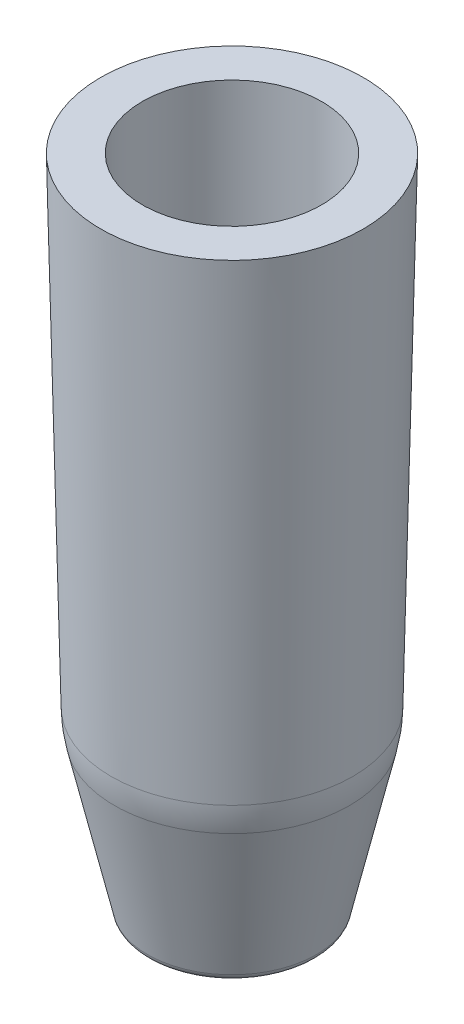
ISO-10303-21;
HEADER;
FILE_DESCRIPTION(('STEP AP214'),'2;1');
FILE_NAME('part.step','',(''),(''),'','','');
FILE_SCHEMA(('AUTOMOTIVE_DESIGN { 1 0 10303 214 1 1 1 1 }'));
ENDSEC;
DATA;
#1=APPLICATION_CONTEXT('core data for automotive mechanical design processes');
#2=APPLICATION_PROTOCOL_DEFINITION('international standard','automotive_design',2000,#1);
#3=PRODUCT_CONTEXT('',#1,'mechanical');
#4=PRODUCT('Part','Part','',(#3));
#5=PRODUCT_RELATED_PRODUCT_CATEGORY('part','',(#4));
#6=PRODUCT_DEFINITION_FORMATION('','',#4);
#7=PRODUCT_DEFINITION_CONTEXT('part definition',#1,'design');
#8=PRODUCT_DEFINITION('design','',#6,#7);
#9=PRODUCT_DEFINITION_SHAPE('','',#8);
#10=(LENGTH_UNIT() NAMED_UNIT(*) SI_UNIT(.MILLI.,.METRE.));
#11=(NAMED_UNIT(*) PLANE_ANGLE_UNIT() SI_UNIT($,.RADIAN.));
#12=(NAMED_UNIT(*) SI_UNIT($,.STERADIAN.) SOLID_ANGLE_UNIT());
#13=UNCERTAINTY_MEASURE_WITH_UNIT(LENGTH_MEASURE(1.E-05),#10,'distance_accuracy_value','');
#14=(GEOMETRIC_REPRESENTATION_CONTEXT(3) GLOBAL_UNCERTAINTY_ASSIGNED_CONTEXT((#13)) GLOBAL_UNIT_ASSIGNED_CONTEXT((#10,
#11,#12)) REPRESENTATION_CONTEXT('',''));
#15=CARTESIAN_POINT('',(0.,0.,0.));
#16=DIRECTION('',(0.,0.,1.));
#17=DIRECTION('',(1.,0.,0.));
#18=AXIS2_PLACEMENT_3D('',#15,#16,#17);
#19=CARTESIAN_POINT('',(0.,0.,0.));
#20=DIRECTION('',(0.,1.,0.));
#21=DIRECTION('',(-1.,0.,0.));
#22=AXIS2_PLACEMENT_3D('',#19,#20,#21);
#23=CONICAL_SURFACE('',#22,2.93,0.0218147207480758);
#24=CARTESIAN_POINT('',(0.,-10.696904041107,0.));
#25=DIRECTION('',(0.,-1.,0.));
#26=DIRECTION('',(1.,0.,0.));
#27=AXIS2_PLACEMENT_3D('',#24,#25,#26);
#28=CIRCLE('',#27,2.69661300273948);
#29=CARTESIAN_POINT('',(2.69661300273948,-10.696904041107,0.));
#30=VERTEX_POINT('',#29);
#31=EDGE_CURVE('E39',#30,#30,#28,.F.);
#32=ORIENTED_EDGE('',*,*,#31,.T.);
#33=EDGE_LOOP('',(#32));
#34=FACE_BOUND('',#33,.T.);
#35=CARTESIAN_POINT('',(0.,0.,0.));
#36=DIRECTION('',(0.,1.,0.));
#37=DIRECTION('',(-1.,0.,0.));
#38=AXIS2_PLACEMENT_3D('',#35,#36,#37);
#39=CIRCLE('',#38,2.93);
#40=CARTESIAN_POINT('',(-2.93,0.,0.));
#41=VERTEX_POINT('',#40);
#42=EDGE_CURVE('E64',#41,#41,#39,.T.);
#43=ORIENTED_EDGE('',*,*,#42,.F.);
#44=EDGE_LOOP('',(#43));
#45=FACE_BOUND('',#44,.T.);
#46=ADVANCED_FACE('F32',(#34,#45),#23,.T.);
#47=CARTESIAN_POINT('',(0.,-11.,0.));
#48=DIRECTION('',(0.,1.,0.));
#49=DIRECTION('',(-1.,0.,0.));
#50=AXIS2_PLACEMENT_3D('',#47,#48,#49);
#51=CONICAL_SURFACE('',#50,2.69,0.223242956285072);
#52=CARTESIAN_POINT('',(0.,-11.2956448576562,0.));
#53=DIRECTION('',(0.,-1.,0.));
#54=DIRECTION('',(1.,0.,0.));
#55=AXIS2_PLACEMENT_3D('',#52,#53,#54);
#56=CIRCLE('',#55,2.62288062691049);
#57=CARTESIAN_POINT('',(2.62288062691049,-11.2956448576562,0.));
#58=VERTEX_POINT('',#57);
#59=EDGE_CURVE('E10',#58,#58,#56,.T.);
#60=ORIENTED_EDGE('',*,*,#59,.T.);
#61=EDGE_LOOP('',(#60));
#62=FACE_BOUND('',#61,.T.);
#63=CARTESIAN_POINT('',(0.,-14.5442786525533,0.));
#64=DIRECTION('',(0.,-1.,0.));
#65=DIRECTION('',(1.,0.,0.));
#66=AXIS2_PLACEMENT_3D('',#63,#64,#65);
#67=CIRCLE('',#66,1.88535295455546);
#68=CARTESIAN_POINT('',(1.88535295455546,-14.5442786525533,0.));
#69=VERTEX_POINT('',#68);
#70=EDGE_CURVE('E47',#69,#69,#67,.F.);
#71=ORIENTED_EDGE('',*,*,#70,.T.);
#72=EDGE_LOOP('',(#71));
#73=FACE_BOUND('',#72,.T.);
#74=ADVANCED_FACE('F72',(#62,#73),#51,.T.);
#75=CARTESIAN_POINT('',(-1.85,-14.7,0.));
#76=DIRECTION('',(0.,-1.,0.));
#77=DIRECTION('',(1.,0.,0.));
#78=AXIS2_PLACEMENT_3D('',#75,#76,#77);
#79=PLANE('',#78);
#80=CARTESIAN_POINT('',(0.,-14.7,0.));
#81=DIRECTION('',(0.,-1.,0.));
#82=DIRECTION('',(1.,0.,0.));
#83=AXIS2_PLACEMENT_3D('',#80,#81,#82);
#84=CIRCLE('',#83,1.69031603259436);
#85=CARTESIAN_POINT('',(1.69031603259436,-14.7,0.));
#86=VERTEX_POINT('',#85);
#87=EDGE_CURVE('E43',#86,#86,#84,.T.);
#88=ORIENTED_EDGE('',*,*,#87,.T.);
#89=EDGE_LOOP('',(#88));
#90=FACE_BOUND('',#89,.T.);
#91=CARTESIAN_POINT('',(0.,-14.7,0.));
#92=DIRECTION('',(0.,1.,0.));
#93=DIRECTION('',(-1.,0.,0.));
#94=AXIS2_PLACEMENT_3D('',#91,#92,#93);
#95=CIRCLE('',#94,1.);
#96=CARTESIAN_POINT('',(-0.999999999999998,-14.7,0.));
#97=VERTEX_POINT('',#96);
#98=EDGE_CURVE('E52',#97,#97,#95,.T.);
#99=ORIENTED_EDGE('',*,*,#98,.T.);
#100=EDGE_LOOP('',(#99));
#101=FACE_BOUND('',#100,.T.);
#102=ADVANCED_FACE('F77',(#90,#101),#79,.T.);
#103=CARTESIAN_POINT('',(0.,-14.7,0.));
#104=DIRECTION('',(0.,1.,0.));
#105=DIRECTION('',(-1.,0.,0.));
#106=AXIS2_PLACEMENT_3D('',#103,#104,#105);
#107=CONICAL_SURFACE('',#106,1.,0.105665582099856);
#108=CARTESIAN_POINT('',(0.,-8.1,0.));
#109=DIRECTION('',(0.,1.,0.));
#110=DIRECTION('',(-1.,0.,0.));
#111=AXIS2_PLACEMENT_3D('',#108,#109,#110);
#112=CIRCLE('',#111,1.7);
#113=CARTESIAN_POINT('',(-1.7,-8.1,0.));
#114=VERTEX_POINT('',#113);
#115=EDGE_CURVE('E55',#114,#114,#112,.T.);
#116=ORIENTED_EDGE('',*,*,#115,.T.);
#117=EDGE_LOOP('',(#116));
#118=FACE_BOUND('',#117,.T.);
#119=ORIENTED_EDGE('',*,*,#98,.F.);
#120=EDGE_LOOP('',(#119));
#121=FACE_BOUND('',#120,.T.);
#122=ADVANCED_FACE('F97',(#118,#121),#107,.F.);
#123=CARTESIAN_POINT('',(0.,-8.1,0.));
#124=DIRECTION('',(0.,1.,0.));
#125=DIRECTION('',(-1.,0.,0.));
#126=AXIS2_PLACEMENT_3D('',#123,#124,#125);
#127=CONICAL_SURFACE('',#126,1.7,0.785398163397448);
#128=CARTESIAN_POINT('',(0.,-7.8,0.));
#129=DIRECTION('',(0.,1.,0.));
#130=DIRECTION('',(-1.,0.,0.));
#131=AXIS2_PLACEMENT_3D('',#128,#129,#130);
#132=CIRCLE('',#131,2.);
#133=CARTESIAN_POINT('',(-2.,-7.8,0.));
#134=VERTEX_POINT('',#133);
#135=EDGE_CURVE('E58',#134,#134,#132,.T.);
#136=ORIENTED_EDGE('',*,*,#135,.T.);
#137=EDGE_LOOP('',(#136));
#138=FACE_BOUND('',#137,.T.);
#139=ORIENTED_EDGE('',*,*,#115,.F.);
#140=EDGE_LOOP('',(#139));
#141=FACE_BOUND('',#140,.T.);
#142=ADVANCED_FACE('F101',(#138,#141),#127,.F.);
#143=CARTESIAN_POINT('',(0.,0.,0.));
#144=DIRECTION('',(0.,1.,0.));
#145=DIRECTION('',(-1.,0.,0.));
#146=AXIS2_PLACEMENT_3D('',#143,#144,#145);
#147=CYLINDRICAL_SURFACE('',#146,2.);
#148=CARTESIAN_POINT('',(0.,0.,0.));
#149=DIRECTION('',(0.,1.,0.));
#150=DIRECTION('',(-1.,0.,0.));
#151=AXIS2_PLACEMENT_3D('',#148,#149,#150);
#152=CIRCLE('',#151,2.);
#153=CARTESIAN_POINT('',(-2.,0.,0.));
#154=VERTEX_POINT('',#153);
#155=EDGE_CURVE('E61',#154,#154,#152,.T.);
#156=ORIENTED_EDGE('',*,*,#155,.T.);
#157=EDGE_LOOP('',(#156));
#158=FACE_BOUND('',#157,.T.);
#159=ORIENTED_EDGE('',*,*,#135,.F.);
#160=EDGE_LOOP('',(#159));
#161=FACE_BOUND('',#160,.T.);
#162=ADVANCED_FACE('F88',(#158,#161),#147,.F.);
#163=CARTESIAN_POINT('',(-2.,0.,0.));
#164=DIRECTION('',(0.,1.,0.));
#165=DIRECTION('',(-1.,0.,0.));
#166=AXIS2_PLACEMENT_3D('',#163,#164,#165);
#167=PLANE('',#166);
#168=ORIENTED_EDGE('',*,*,#42,.T.);
#169=EDGE_LOOP('',(#168));
#170=FACE_BOUND('',#169,.T.);
#171=ORIENTED_EDGE('',*,*,#155,.F.);
#172=EDGE_LOOP('',(#171));
#173=FACE_BOUND('',#172,.T.);
#174=ADVANCED_FACE('F68',(#170,#173),#167,.T.);
#175=CARTESIAN_POINT('',(0.,-14.5,0.));
#176=DIRECTION('',(0.,-1.,0.));
#177=DIRECTION('',(1.,0.,0.));
#178=AXIS2_PLACEMENT_3D('',#175,#176,#177);
#179=TOROIDAL_SURFACE('',#178,1.69031603259436,0.2);
#180=ORIENTED_EDGE('',*,*,#87,.F.);
#181=EDGE_LOOP('',(#180));
#182=FACE_BOUND('',#181,.T.);
#183=ORIENTED_EDGE('',*,*,#70,.F.);
#184=EDGE_LOOP('',(#183));
#185=FACE_BOUND('',#184,.T.);
#186=ADVANCED_FACE('F80',(#182,#185),#179,.T.);
#187=CARTESIAN_POINT('',(0.,-10.6314650693562,0.));
#188=DIRECTION('',(0.,-1.,0.));
#189=DIRECTION('',(1.,0.,0.));
#190=AXIS2_PLACEMENT_3D('',#187,#188,#189);
#191=DEGENERATE_TOROIDAL_SURFACE('',#190,0.302673202506058,3.,.F.);
#192=ORIENTED_EDGE('',*,*,#59,.F.);
#193=EDGE_LOOP('',(#192));
#194=FACE_BOUND('',#193,.T.);
#195=ORIENTED_EDGE('',*,*,#31,.F.);
#196=EDGE_LOOP('',(#195));
#197=FACE_BOUND('',#196,.T.);
#198=ADVANCED_FACE('F34',(#194,#197),#191,.F.);
#199=CLOSED_SHELL('',(#46,#74,#102,#122,#142,#162,#174,#186,#198));
#200=MANIFOLD_SOLID_BREP('B2',#199);
#201=ADVANCED_BREP_SHAPE_REPRESENTATION('',(#18,#200),#14);
#202=SHAPE_DEFINITION_REPRESENTATION(#9,#201);
ENDSEC;
END-ISO-10303-21;
